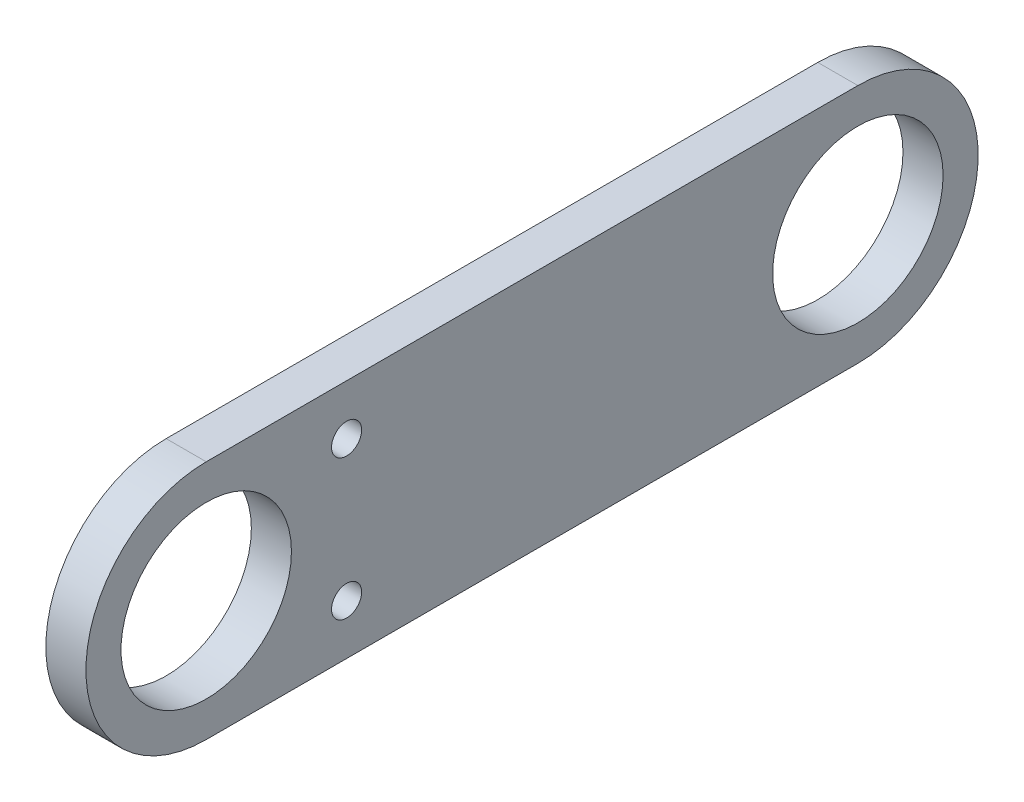
ISO-10303-21;
HEADER;
FILE_DESCRIPTION(('STEP AP214'),'2;1');
FILE_NAME('part.step','',(''),(''),'','','');
FILE_SCHEMA(('AUTOMOTIVE_DESIGN { 1 0 10303 214 1 1 1 1 }'));
ENDSEC;
DATA;
#1=APPLICATION_CONTEXT('core data for automotive mechanical design processes');
#2=APPLICATION_PROTOCOL_DEFINITION('international standard','automotive_design',2000,#1);
#3=PRODUCT_CONTEXT('',#1,'mechanical');
#4=PRODUCT('Part','Part','',(#3));
#5=PRODUCT_RELATED_PRODUCT_CATEGORY('part','',(#4));
#6=PRODUCT_DEFINITION_FORMATION('','',#4);
#7=PRODUCT_DEFINITION_CONTEXT('part definition',#1,'design');
#8=PRODUCT_DEFINITION('design','',#6,#7);
#9=PRODUCT_DEFINITION_SHAPE('','',#8);
#10=(LENGTH_UNIT() NAMED_UNIT(*) SI_UNIT(.MILLI.,.METRE.));
#11=(NAMED_UNIT(*) PLANE_ANGLE_UNIT() SI_UNIT($,.RADIAN.));
#12=(NAMED_UNIT(*) SI_UNIT($,.STERADIAN.) SOLID_ANGLE_UNIT());
#13=UNCERTAINTY_MEASURE_WITH_UNIT(LENGTH_MEASURE(1.E-05),#10,'distance_accuracy_value','');
#14=(GEOMETRIC_REPRESENTATION_CONTEXT(3) GLOBAL_UNCERTAINTY_ASSIGNED_CONTEXT((#13)) GLOBAL_UNIT_ASSIGNED_CONTEXT((#10,
#11,#12)) REPRESENTATION_CONTEXT('',''));
#15=CARTESIAN_POINT('',(0.,0.,0.));
#16=DIRECTION('',(0.,0.,1.));
#17=DIRECTION('',(1.,0.,0.));
#18=AXIS2_PLACEMENT_3D('',#15,#16,#17);
#19=CARTESIAN_POINT('',(4.,12.,0.));
#20=DIRECTION('',(0.,1.,0.));
#21=DIRECTION('',(0.,0.,1.));
#22=AXIS2_PLACEMENT_3D('',#19,#20,#21);
#23=PLANE('',#22);
#24=DIRECTION('',(0.,0.,-1.));
#25=VECTOR('',#24,1.);
#26=CARTESIAN_POINT('',(0.,12.,0.));
#27=LINE('',#26,#25);
#28=CARTESIAN_POINT('',(0.,12.,9.));
#29=VERTEX_POINT('',#28);
#30=CARTESIAN_POINT('',(0.,12.,-56.));
#31=VERTEX_POINT('',#30);
#32=EDGE_CURVE('E115',#29,#31,#27,.T.);
#33=ORIENTED_EDGE('',*,*,#32,.F.);
#34=DIRECTION('',(-1.,0.,0.));
#35=VECTOR('',#34,1.);
#36=CARTESIAN_POINT('',(4.,12.,9.));
#37=LINE('',#36,#35);
#38=CARTESIAN_POINT('',(4.,12.,9.));
#39=VERTEX_POINT('',#38);
#40=EDGE_CURVE('E11',#39,#29,#37,.T.);
#41=ORIENTED_EDGE('',*,*,#40,.F.);
#42=DIRECTION('',(0.,0.,-1.));
#43=VECTOR('',#42,1.);
#44=CARTESIAN_POINT('',(4.,12.,0.));
#45=LINE('',#44,#43);
#46=CARTESIAN_POINT('',(4.,12.,-56.));
#47=VERTEX_POINT('',#46);
#48=EDGE_CURVE('E88',#39,#47,#45,.T.);
#49=ORIENTED_EDGE('',*,*,#48,.T.);
#50=DIRECTION('',(-1.,0.,0.));
#51=VECTOR('',#50,1.);
#52=CARTESIAN_POINT('',(4.,12.,-56.));
#53=LINE('',#52,#51);
#54=EDGE_CURVE('E56',#47,#31,#53,.T.);
#55=ORIENTED_EDGE('',*,*,#54,.T.);
#56=EDGE_LOOP('',(#33,#41,#49,#55));
#57=FACE_BOUND('',#56,.T.);
#58=ADVANCED_FACE('F39',(#57),#23,.T.);
#59=CARTESIAN_POINT('',(4.,0.,9.));
#60=DIRECTION('',(-1.,0.,0.));
#61=DIRECTION('',(0.,0.,1.));
#62=AXIS2_PLACEMENT_3D('',#59,#60,#61);
#63=CYLINDRICAL_SURFACE('',#62,12.);
#64=CARTESIAN_POINT('',(0.,0.,9.));
#65=DIRECTION('',(1.,0.,0.));
#66=DIRECTION('',(0.,0.,-1.));
#67=AXIS2_PLACEMENT_3D('',#64,#65,#66);
#68=CIRCLE('',#67,12.);
#69=CARTESIAN_POINT('',(0.,-12.,9.));
#70=VERTEX_POINT('',#69);
#71=EDGE_CURVE('E94',#29,#70,#68,.T.);
#72=ORIENTED_EDGE('',*,*,#71,.T.);
#73=DIRECTION('',(-1.,0.,0.));
#74=VECTOR('',#73,1.);
#75=CARTESIAN_POINT('',(4.,-12.,9.));
#76=LINE('',#75,#74);
#77=CARTESIAN_POINT('',(4.,-12.,9.));
#78=VERTEX_POINT('',#77);
#79=EDGE_CURVE('E48',#78,#70,#76,.T.);
#80=ORIENTED_EDGE('',*,*,#79,.F.);
#81=CARTESIAN_POINT('',(4.,0.,9.));
#82=DIRECTION('',(1.,0.,0.));
#83=DIRECTION('',(0.,0.,-1.));
#84=AXIS2_PLACEMENT_3D('',#81,#82,#83);
#85=CIRCLE('',#84,12.);
#86=EDGE_CURVE('E82',#39,#78,#85,.T.);
#87=ORIENTED_EDGE('',*,*,#86,.F.);
#88=ORIENTED_EDGE('',*,*,#40,.T.);
#89=EDGE_LOOP('',(#72,#80,#87,#88));
#90=FACE_BOUND('',#89,.T.);
#91=ADVANCED_FACE('F92',(#90),#63,.T.);
#92=CARTESIAN_POINT('',(4.,-12.,0.));
#93=DIRECTION('',(0.,-1.,0.));
#94=DIRECTION('',(0.,0.,-1.));
#95=AXIS2_PLACEMENT_3D('',#92,#93,#94);
#96=PLANE('',#95);
#97=DIRECTION('',(0.,0.,1.));
#98=VECTOR('',#97,1.);
#99=CARTESIAN_POINT('',(0.,-12.,0.));
#100=LINE('',#99,#98);
#101=CARTESIAN_POINT('',(0.,-12.,-56.));
#102=VERTEX_POINT('',#101);
#103=EDGE_CURVE('E118',#102,#70,#100,.T.);
#104=ORIENTED_EDGE('',*,*,#103,.F.);
#105=DIRECTION('',(-1.,0.,0.));
#106=VECTOR('',#105,1.);
#107=CARTESIAN_POINT('',(4.,-12.,-56.));
#108=LINE('',#107,#106);
#109=CARTESIAN_POINT('',(4.,-12.,-56.));
#110=VERTEX_POINT('',#109);
#111=EDGE_CURVE('E69',#110,#102,#108,.T.);
#112=ORIENTED_EDGE('',*,*,#111,.F.);
#113=DIRECTION('',(0.,0.,1.));
#114=VECTOR('',#113,1.);
#115=CARTESIAN_POINT('',(4.,-12.,0.));
#116=LINE('',#115,#114);
#117=EDGE_CURVE('E87',#110,#78,#116,.T.);
#118=ORIENTED_EDGE('',*,*,#117,.T.);
#119=ORIENTED_EDGE('',*,*,#79,.T.);
#120=EDGE_LOOP('',(#104,#112,#118,#119));
#121=FACE_BOUND('',#120,.T.);
#122=ADVANCED_FACE('F97',(#121),#96,.T.);
#123=CARTESIAN_POINT('',(4.,0.,9.));
#124=DIRECTION('',(-1.,0.,0.));
#125=DIRECTION('',(0.,0.,1.));
#126=AXIS2_PLACEMENT_3D('',#123,#124,#125);
#127=CYLINDRICAL_SURFACE('',#126,8.5);
#128=CARTESIAN_POINT('',(4.,0.,9.));
#129=DIRECTION('',(1.,0.,0.));
#130=DIRECTION('',(0.,0.,-1.));
#131=AXIS2_PLACEMENT_3D('',#128,#129,#130);
#132=CIRCLE('',#131,8.5);
#133=CARTESIAN_POINT('',(4.,0.,0.499999999999999));
#134=VERTEX_POINT('',#133);
#135=EDGE_CURVE('E137',#134,#134,#132,.T.);
#136=ORIENTED_EDGE('',*,*,#135,.T.);
#137=EDGE_LOOP('',(#136));
#138=FACE_BOUND('',#137,.T.);
#139=CARTESIAN_POINT('',(0.,0.,9.));
#140=DIRECTION('',(1.,0.,0.));
#141=DIRECTION('',(0.,0.,-1.));
#142=AXIS2_PLACEMENT_3D('',#139,#140,#141);
#143=CIRCLE('',#142,8.5);
#144=CARTESIAN_POINT('',(0.,0.,0.499999999999999));
#145=VERTEX_POINT('',#144);
#146=EDGE_CURVE('E112',#145,#145,#143,.T.);
#147=ORIENTED_EDGE('',*,*,#146,.F.);
#148=EDGE_LOOP('',(#147));
#149=FACE_BOUND('',#148,.T.);
#150=ADVANCED_FACE('F159',(#138,#149),#127,.F.);
#151=CARTESIAN_POINT('',(4.,-7.,-5.00000000000015));
#152=DIRECTION('',(-1.,0.,0.));
#153=DIRECTION('',(0.,0.,1.));
#154=AXIS2_PLACEMENT_3D('',#151,#152,#153);
#155=CYLINDRICAL_SURFACE('',#154,1.5);
#156=CARTESIAN_POINT('',(4.,-7.,-5.00000000000015));
#157=DIRECTION('',(1.,0.,0.));
#158=DIRECTION('',(0.,0.,-1.));
#159=AXIS2_PLACEMENT_3D('',#156,#157,#158);
#160=CIRCLE('',#159,1.5);
#161=CARTESIAN_POINT('',(4.,-7.,-6.50000000000015));
#162=VERTEX_POINT('',#161);
#163=EDGE_CURVE('E132',#162,#162,#160,.T.);
#164=ORIENTED_EDGE('',*,*,#163,.T.);
#165=EDGE_LOOP('',(#164));
#166=FACE_BOUND('',#165,.T.);
#167=CARTESIAN_POINT('',(0.,-7.,-5.00000000000015));
#168=DIRECTION('',(1.,0.,0.));
#169=DIRECTION('',(0.,0.,-1.));
#170=AXIS2_PLACEMENT_3D('',#167,#168,#169);
#171=CIRCLE('',#170,1.5);
#172=CARTESIAN_POINT('',(0.,-7.,-6.50000000000015));
#173=VERTEX_POINT('',#172);
#174=EDGE_CURVE('E109',#173,#173,#171,.T.);
#175=ORIENTED_EDGE('',*,*,#174,.F.);
#176=EDGE_LOOP('',(#175));
#177=FACE_BOUND('',#176,.T.);
#178=ADVANCED_FACE('F162',(#166,#177),#155,.F.);
#179=CARTESIAN_POINT('',(4.,0.,-56.));
#180=DIRECTION('',(-1.,0.,0.));
#181=DIRECTION('',(0.,0.,1.));
#182=AXIS2_PLACEMENT_3D('',#179,#180,#181);
#183=CYLINDRICAL_SURFACE('',#182,8.50000000000002);
#184=CARTESIAN_POINT('',(4.,0.,-56.));
#185=DIRECTION('',(1.,0.,0.));
#186=DIRECTION('',(0.,0.,-1.));
#187=AXIS2_PLACEMENT_3D('',#184,#185,#186);
#188=CIRCLE('',#187,8.50000000000002);
#189=CARTESIAN_POINT('',(4.,0.,-64.5));
#190=VERTEX_POINT('',#189);
#191=EDGE_CURVE('E127',#190,#190,#188,.T.);
#192=ORIENTED_EDGE('',*,*,#191,.T.);
#193=EDGE_LOOP('',(#192));
#194=FACE_BOUND('',#193,.T.);
#195=CARTESIAN_POINT('',(0.,0.,-56.));
#196=DIRECTION('',(1.,0.,0.));
#197=DIRECTION('',(0.,0.,-1.));
#198=AXIS2_PLACEMENT_3D('',#195,#196,#197);
#199=CIRCLE('',#198,8.50000000000002);
#200=CARTESIAN_POINT('',(0.,0.,-64.5));
#201=VERTEX_POINT('',#200);
#202=EDGE_CURVE('E106',#201,#201,#199,.T.);
#203=ORIENTED_EDGE('',*,*,#202,.F.);
#204=EDGE_LOOP('',(#203));
#205=FACE_BOUND('',#204,.T.);
#206=ADVANCED_FACE('F149',(#194,#205),#183,.F.);
#207=CARTESIAN_POINT('',(4.,7.,-5.));
#208=DIRECTION('',(-1.,0.,0.));
#209=DIRECTION('',(0.,0.,1.));
#210=AXIS2_PLACEMENT_3D('',#207,#208,#209);
#211=CYLINDRICAL_SURFACE('',#210,1.5);
#212=CARTESIAN_POINT('',(4.,7.,-5.));
#213=DIRECTION('',(1.,0.,0.));
#214=DIRECTION('',(0.,0.,-1.));
#215=AXIS2_PLACEMENT_3D('',#212,#213,#214);
#216=CIRCLE('',#215,1.5);
#217=CARTESIAN_POINT('',(4.,7.,-6.5));
#218=VERTEX_POINT('',#217);
#219=EDGE_CURVE('E123',#218,#218,#216,.T.);
#220=ORIENTED_EDGE('',*,*,#219,.T.);
#221=EDGE_LOOP('',(#220));
#222=FACE_BOUND('',#221,.T.);
#223=CARTESIAN_POINT('',(0.,7.,-5.));
#224=DIRECTION('',(1.,0.,0.));
#225=DIRECTION('',(0.,0.,-1.));
#226=AXIS2_PLACEMENT_3D('',#223,#224,#225);
#227=CIRCLE('',#226,1.5);
#228=CARTESIAN_POINT('',(0.,7.,-6.5));
#229=VERTEX_POINT('',#228);
#230=EDGE_CURVE('E103',#229,#229,#227,.T.);
#231=ORIENTED_EDGE('',*,*,#230,.F.);
#232=EDGE_LOOP('',(#231));
#233=FACE_BOUND('',#232,.T.);
#234=ADVANCED_FACE('F41',(#222,#233),#211,.F.);
#235=CARTESIAN_POINT('',(4.,0.,-56.));
#236=DIRECTION('',(-1.,0.,0.));
#237=DIRECTION('',(0.,0.,1.));
#238=AXIS2_PLACEMENT_3D('',#235,#236,#237);
#239=CYLINDRICAL_SURFACE('',#238,12.);
#240=CARTESIAN_POINT('',(0.,0.,-56.));
#241=DIRECTION('',(1.,0.,0.));
#242=DIRECTION('',(0.,0.,-1.));
#243=AXIS2_PLACEMENT_3D('',#240,#241,#242);
#244=CIRCLE('',#243,12.);
#245=EDGE_CURVE('E120',#31,#102,#244,.F.);
#246=ORIENTED_EDGE('',*,*,#245,.F.);
#247=ORIENTED_EDGE('',*,*,#54,.F.);
#248=CARTESIAN_POINT('',(4.,0.,-56.));
#249=DIRECTION('',(1.,0.,0.));
#250=DIRECTION('',(0.,0.,-1.));
#251=AXIS2_PLACEMENT_3D('',#248,#249,#250);
#252=CIRCLE('',#251,12.);
#253=EDGE_CURVE('E98',#47,#110,#252,.F.);
#254=ORIENTED_EDGE('',*,*,#253,.T.);
#255=ORIENTED_EDGE('',*,*,#111,.T.);
#256=EDGE_LOOP('',(#246,#247,#254,#255));
#257=FACE_BOUND('',#256,.T.);
#258=ADVANCED_FACE('F139',(#257),#239,.T.);
#259=CARTESIAN_POINT('',(4.,0.,0.));
#260=DIRECTION('',(1.,0.,0.));
#261=DIRECTION('',(0.,0.,-1.));
#262=AXIS2_PLACEMENT_3D('',#259,#260,#261);
#263=PLANE('',#262);
#264=ORIENTED_EDGE('',*,*,#219,.F.);
#265=EDGE_LOOP('',(#264));
#266=FACE_BOUND('',#265,.T.);
#267=ORIENTED_EDGE('',*,*,#191,.F.);
#268=EDGE_LOOP('',(#267));
#269=FACE_BOUND('',#268,.T.);
#270=ORIENTED_EDGE('',*,*,#163,.F.);
#271=EDGE_LOOP('',(#270));
#272=FACE_BOUND('',#271,.T.);
#273=ORIENTED_EDGE('',*,*,#135,.F.);
#274=EDGE_LOOP('',(#273));
#275=FACE_BOUND('',#274,.T.);
#276=ORIENTED_EDGE('',*,*,#48,.F.);
#277=ORIENTED_EDGE('',*,*,#86,.T.);
#278=ORIENTED_EDGE('',*,*,#117,.F.);
#279=ORIENTED_EDGE('',*,*,#253,.F.);
#280=EDGE_LOOP('',(#276,#277,#278,#279));
#281=FACE_BOUND('',#280,.T.);
#282=ADVANCED_FACE('F84',(#266,#269,#272,#275,#281),#263,.T.);
#283=CARTESIAN_POINT('',(0.,0.,0.));
#284=DIRECTION('',(1.,0.,0.));
#285=DIRECTION('',(0.,0.,-1.));
#286=AXIS2_PLACEMENT_3D('',#283,#284,#285);
#287=PLANE('',#286);
#288=ORIENTED_EDGE('',*,*,#230,.T.);
#289=EDGE_LOOP('',(#288));
#290=FACE_BOUND('',#289,.T.);
#291=ORIENTED_EDGE('',*,*,#202,.T.);
#292=EDGE_LOOP('',(#291));
#293=FACE_BOUND('',#292,.T.);
#294=ORIENTED_EDGE('',*,*,#174,.T.);
#295=EDGE_LOOP('',(#294));
#296=FACE_BOUND('',#295,.T.);
#297=ORIENTED_EDGE('',*,*,#146,.T.);
#298=EDGE_LOOP('',(#297));
#299=FACE_BOUND('',#298,.T.);
#300=ORIENTED_EDGE('',*,*,#32,.T.);
#301=ORIENTED_EDGE('',*,*,#245,.T.);
#302=ORIENTED_EDGE('',*,*,#103,.T.);
#303=ORIENTED_EDGE('',*,*,#71,.F.);
#304=EDGE_LOOP('',(#300,#301,#302,#303));
#305=FACE_BOUND('',#304,.T.);
#306=ADVANCED_FACE('F146',(#290,#293,#296,#299,#305),#287,.F.);
#307=CLOSED_SHELL('',(#58,#91,#122,#150,#178,#206,#234,#258,#282,#306));
#308=MANIFOLD_SOLID_BREP('B2',#307);
#309=ADVANCED_BREP_SHAPE_REPRESENTATION('',(#18,#308),#14);
#310=SHAPE_DEFINITION_REPRESENTATION(#9,#309);
ENDSEC;
END-ISO-10303-21;
